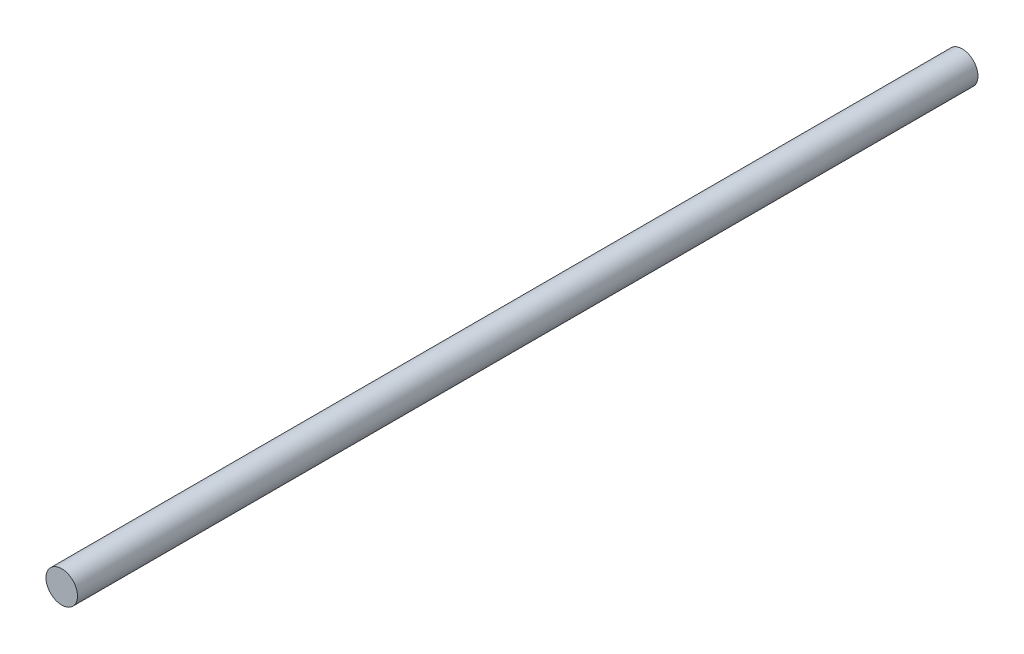
ISO-10303-21;
HEADER;
FILE_DESCRIPTION(('STEP AP214'),'2;1');
FILE_NAME('part.step','',(''),(''),'','','');
FILE_SCHEMA(('AUTOMOTIVE_DESIGN { 1 0 10303 214 1 1 1 1 }'));
ENDSEC;
DATA;
#1=APPLICATION_CONTEXT('core data for automotive mechanical design processes');
#2=APPLICATION_PROTOCOL_DEFINITION('international standard','automotive_design',2000,#1);
#3=PRODUCT_CONTEXT('',#1,'mechanical');
#4=PRODUCT('Part','Part','',(#3));
#5=PRODUCT_RELATED_PRODUCT_CATEGORY('part','',(#4));
#6=PRODUCT_DEFINITION_FORMATION('','',#4);
#7=PRODUCT_DEFINITION_CONTEXT('part definition',#1,'design');
#8=PRODUCT_DEFINITION('design','',#6,#7);
#9=PRODUCT_DEFINITION_SHAPE('','',#8);
#10=(LENGTH_UNIT() NAMED_UNIT(*) SI_UNIT(.MILLI.,.METRE.));
#11=(NAMED_UNIT(*) PLANE_ANGLE_UNIT() SI_UNIT($,.RADIAN.));
#12=(NAMED_UNIT(*) SI_UNIT($,.STERADIAN.) SOLID_ANGLE_UNIT());
#13=UNCERTAINTY_MEASURE_WITH_UNIT(LENGTH_MEASURE(1.E-05),#10,'distance_accuracy_value','');
#14=(GEOMETRIC_REPRESENTATION_CONTEXT(3) GLOBAL_UNCERTAINTY_ASSIGNED_CONTEXT((#13)) GLOBAL_UNIT_ASSIGNED_CONTEXT((#10,
#11,#12)) REPRESENTATION_CONTEXT('',''));
#15=CARTESIAN_POINT('',(0.,0.,0.));
#16=DIRECTION('',(0.,0.,1.));
#17=DIRECTION('',(1.,0.,0.));
#18=AXIS2_PLACEMENT_3D('',#15,#16,#17);
#19=CARTESIAN_POINT('',(-20.,0.,400.));
#20=DIRECTION('',(0.,0.,-1.));
#21=DIRECTION('',(-1.,0.,0.));
#22=AXIS2_PLACEMENT_3D('',#19,#20,#21);
#23=CYLINDRICAL_SURFACE('',#22,7.);
#24=CARTESIAN_POINT('',(-20.,0.,400.));
#25=DIRECTION('',(0.,0.,1.));
#26=DIRECTION('',(1.,0.,0.));
#27=AXIS2_PLACEMENT_3D('',#24,#25,#26);
#28=CIRCLE('',#27,7.);
#29=CARTESIAN_POINT('',(-13.,0.,400.));
#30=VERTEX_POINT('',#29);
#31=EDGE_CURVE('E10',#30,#30,#28,.T.);
#32=ORIENTED_EDGE('',*,*,#31,.F.);
#33=EDGE_LOOP('',(#32));
#34=FACE_BOUND('',#33,.T.);
#35=CARTESIAN_POINT('',(-20.,0.,0.));
#36=DIRECTION('',(0.,0.,1.));
#37=DIRECTION('',(1.,0.,0.));
#38=AXIS2_PLACEMENT_3D('',#35,#36,#37);
#39=CIRCLE('',#38,7.);
#40=CARTESIAN_POINT('',(-13.,0.,0.));
#41=VERTEX_POINT('',#40);
#42=EDGE_CURVE('E40',#41,#41,#39,.T.);
#43=ORIENTED_EDGE('',*,*,#42,.T.);
#44=EDGE_LOOP('',(#43));
#45=FACE_BOUND('',#44,.T.);
#46=ADVANCED_FACE('F37',(#34,#45),#23,.T.);
#47=CARTESIAN_POINT('',(-20.,0.,400.));
#48=DIRECTION('',(0.,0.,1.));
#49=DIRECTION('',(1.,0.,0.));
#50=AXIS2_PLACEMENT_3D('',#47,#48,#49);
#51=PLANE('',#50);
#52=ORIENTED_EDGE('',*,*,#31,.T.);
#53=EDGE_LOOP('',(#52));
#54=FACE_BOUND('',#53,.T.);
#55=ADVANCED_FACE('F52',(#54),#51,.T.);
#56=CARTESIAN_POINT('',(-20.,0.,0.));
#57=DIRECTION('',(0.,0.,1.));
#58=DIRECTION('',(1.,0.,0.));
#59=AXIS2_PLACEMENT_3D('',#56,#57,#58);
#60=PLANE('',#59);
#61=ORIENTED_EDGE('',*,*,#42,.F.);
#62=EDGE_LOOP('',(#61));
#63=FACE_BOUND('',#62,.T.);
#64=ADVANCED_FACE('F50',(#63),#60,.F.);
#65=CLOSED_SHELL('',(#46,#55,#64));
#66=MANIFOLD_SOLID_BREP('B2',#65);
#67=ADVANCED_BREP_SHAPE_REPRESENTATION('',(#18,#66),#14);
#68=SHAPE_DEFINITION_REPRESENTATION(#9,#67);
ENDSEC;
END-ISO-10303-21;
